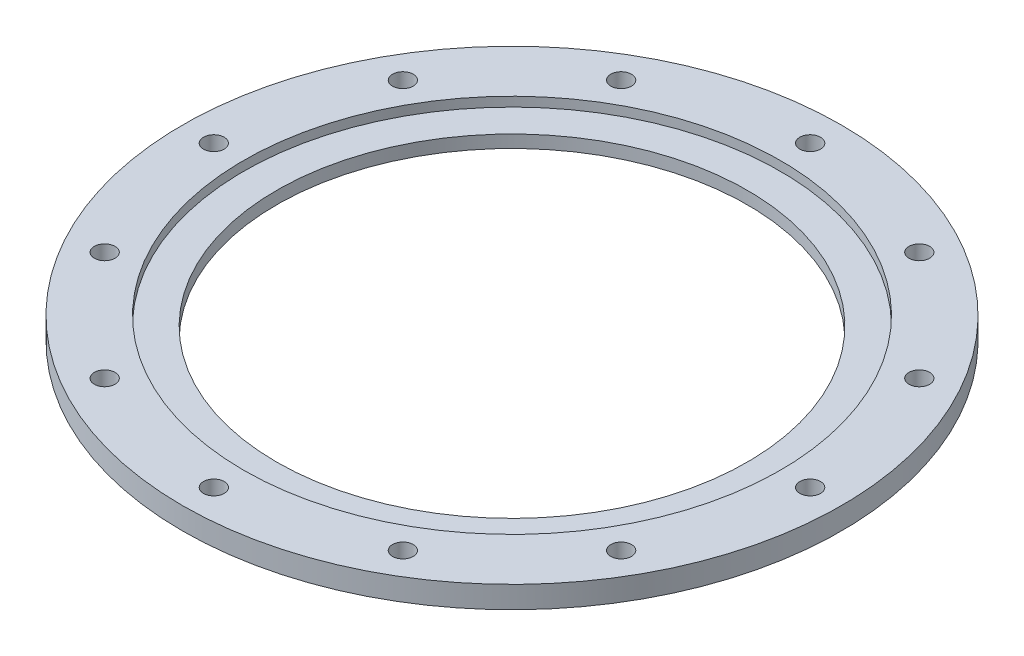
ISO-10303-21;
HEADER;
FILE_DESCRIPTION(('STEP AP214'),'2;1');
FILE_NAME('part.step','',(''),(''),'','','');
FILE_SCHEMA(('AUTOMOTIVE_DESIGN { 1 0 10303 214 1 1 1 1 }'));
ENDSEC;
DATA;
#1=APPLICATION_CONTEXT('core data for automotive mechanical design processes');
#2=APPLICATION_PROTOCOL_DEFINITION('international standard','automotive_design',2000,#1);
#3=PRODUCT_CONTEXT('',#1,'mechanical');
#4=PRODUCT('Part','Part','',(#3));
#5=PRODUCT_RELATED_PRODUCT_CATEGORY('part','',(#4));
#6=PRODUCT_DEFINITION_FORMATION('','',#4);
#7=PRODUCT_DEFINITION_CONTEXT('part definition',#1,'design');
#8=PRODUCT_DEFINITION('design','',#6,#7);
#9=PRODUCT_DEFINITION_SHAPE('','',#8);
#10=(LENGTH_UNIT() NAMED_UNIT(*) SI_UNIT(.MILLI.,.METRE.));
#11=(NAMED_UNIT(*) PLANE_ANGLE_UNIT() SI_UNIT($,.RADIAN.));
#12=(NAMED_UNIT(*) SI_UNIT($,.STERADIAN.) SOLID_ANGLE_UNIT());
#13=UNCERTAINTY_MEASURE_WITH_UNIT(LENGTH_MEASURE(1.E-05),#10,'distance_accuracy_value','');
#14=(GEOMETRIC_REPRESENTATION_CONTEXT(3) GLOBAL_UNCERTAINTY_ASSIGNED_CONTEXT((#13)) GLOBAL_UNIT_ASSIGNED_CONTEXT((#10,
#11,#12)) REPRESENTATION_CONTEXT('',''));
#15=CARTESIAN_POINT('',(0.,0.,0.));
#16=DIRECTION('',(0.,0.,1.));
#17=DIRECTION('',(1.,0.,0.));
#18=AXIS2_PLACEMENT_3D('',#15,#16,#17);
#19=CARTESIAN_POINT('',(0.,2.,0.));
#20=DIRECTION('',(0.,1.,0.));
#21=DIRECTION('',(0.,0.,1.));
#22=AXIS2_PLACEMENT_3D('',#19,#20,#21);
#23=PLANE('',#22);
#24=CARTESIAN_POINT('',(0.,2.,0.));
#25=DIRECTION('',(0.,1.,0.));
#26=DIRECTION('',(0.,0.,1.));
#27=AXIS2_PLACEMENT_3D('',#24,#25,#26);
#28=CIRCLE('',#27,37.5);
#29=CARTESIAN_POINT('',(0.,2.,37.5));
#30=VERTEX_POINT('',#29);
#31=EDGE_CURVE('E49',#30,#30,#28,.T.);
#32=ORIENTED_EDGE('',*,*,#31,.F.);
#33=EDGE_LOOP('',(#32));
#34=FACE_BOUND('',#33,.T.);
#35=CARTESIAN_POINT('',(0.,2.,0.));
#36=DIRECTION('',(0.,1.,0.));
#37=DIRECTION('',(0.,0.,1.));
#38=AXIS2_PLACEMENT_3D('',#35,#36,#37);
#39=CIRCLE('',#38,42.75);
#40=CARTESIAN_POINT('',(0.,2.,42.75));
#41=VERTEX_POINT('',#40);
#42=EDGE_CURVE('E66',#41,#41,#39,.T.);
#43=ORIENTED_EDGE('',*,*,#42,.T.);
#44=EDGE_LOOP('',(#43));
#45=FACE_BOUND('',#44,.T.);
#46=ADVANCED_FACE('F41',(#34,#45),#23,.T.);
#47=CARTESIAN_POINT('',(0.,0.,0.));
#48=DIRECTION('',(0.,1.,0.));
#49=DIRECTION('',(0.,0.,1.));
#50=AXIS2_PLACEMENT_3D('',#47,#48,#49);
#51=PLANE('',#50);
#52=CARTESIAN_POINT('',(23.7499999999999,0.,-41.1362066797609));
#53=DIRECTION('',(0.,-1.,0.));
#54=DIRECTION('',(-0.86602540378444,0.,-0.499999999999998));
#55=AXIS2_PLACEMENT_3D('',#52,#53,#54);
#56=CIRCLE('',#55,1.65);
#57=CARTESIAN_POINT('',(22.3210580837556,0.,-41.9612066797609));
#58=VERTEX_POINT('',#57);
#59=EDGE_CURVE('E147',#58,#58,#56,.T.);
#60=ORIENTED_EDGE('',*,*,#59,.F.);
#61=EDGE_LOOP('',(#60));
#62=FACE_BOUND('',#61,.T.);
#63=CARTESIAN_POINT('',(-1.65845363595049E-13,0.,-47.5));
#64=DIRECTION('',(0.,-1.,0.));
#65=DIRECTION('',(-1.,0.,0.));
#66=AXIS2_PLACEMENT_3D('',#63,#64,#65);
#67=CIRCLE('',#66,1.65);
#68=CARTESIAN_POINT('',(-1.65000000000016,0.,-47.5));
#69=VERTEX_POINT('',#68);
#70=EDGE_CURVE('E139',#69,#69,#67,.T.);
#71=ORIENTED_EDGE('',*,*,#70,.F.);
#72=EDGE_LOOP('',(#71));
#73=FACE_BOUND('',#72,.T.);
#74=CARTESIAN_POINT('',(-23.7500000000002,0.,-41.1362066797607));
#75=DIRECTION('',(0.,-1.,0.));
#76=DIRECTION('',(-0.866025403784436,0.,0.500000000000004));
#77=AXIS2_PLACEMENT_3D('',#74,#75,#76);
#78=CIRCLE('',#77,1.65);
#79=CARTESIAN_POINT('',(-25.1789419162445,0.,-40.3112066797607));
#80=VERTEX_POINT('',#79);
#81=EDGE_CURVE('E131',#80,#80,#78,.T.);
#82=ORIENTED_EDGE('',*,*,#81,.F.);
#83=EDGE_LOOP('',(#82));
#84=FACE_BOUND('',#83,.T.);
#85=CARTESIAN_POINT('',(-41.136206679761,0.,-23.7499999999998));
#86=DIRECTION('',(0.,-1.,0.));
#87=DIRECTION('',(-0.499999999999995,0.,0.866025403784442));
#88=AXIS2_PLACEMENT_3D('',#85,#86,#87);
#89=CIRCLE('',#88,1.65);
#90=CARTESIAN_POINT('',(-41.961206679761,0.,-22.3210580837554));
#91=VERTEX_POINT('',#90);
#92=EDGE_CURVE('E123',#91,#91,#89,.T.);
#93=ORIENTED_EDGE('',*,*,#92,.F.);
#94=EDGE_LOOP('',(#93));
#95=FACE_BOUND('',#94,.T.);
#96=CARTESIAN_POINT('',(-47.5,0.,0.));
#97=DIRECTION('',(0.,-1.,0.));
#98=DIRECTION('',(0.,0.,1.));
#99=AXIS2_PLACEMENT_3D('',#96,#97,#98);
#100=CIRCLE('',#99,1.65);
#101=CARTESIAN_POINT('',(-47.5,0.,1.65));
#102=VERTEX_POINT('',#101);
#103=EDGE_CURVE('E115',#102,#102,#100,.T.);
#104=ORIENTED_EDGE('',*,*,#103,.F.);
#105=EDGE_LOOP('',(#104));
#106=FACE_BOUND('',#105,.T.);
#107=CARTESIAN_POINT('',(-41.1362066797607,0.,23.7500000000003));
#108=DIRECTION('',(0.,-1.,0.));
#109=DIRECTION('',(0.500000000000007,0.,0.866025403784435));
#110=AXIS2_PLACEMENT_3D('',#107,#108,#109);
#111=CIRCLE('',#110,1.65);
#112=CARTESIAN_POINT('',(-40.3112066797606,0.,25.1789419162447));
#113=VERTEX_POINT('',#112);
#114=EDGE_CURVE('E107',#113,#113,#111,.T.);
#115=ORIENTED_EDGE('',*,*,#114,.F.);
#116=EDGE_LOOP('',(#115));
#117=FACE_BOUND('',#116,.T.);
#118=CARTESIAN_POINT('',(-23.7499999999996,0.,41.1362066797611));
#119=DIRECTION('',(0.,-1.,0.));
#120=DIRECTION('',(0.866025403784443,0.,0.499999999999992));
#121=AXIS2_PLACEMENT_3D('',#118,#119,#120);
#122=CIRCLE('',#121,1.65);
#123=CARTESIAN_POINT('',(-22.3210580837553,0.,41.961206679761));
#124=VERTEX_POINT('',#123);
#125=EDGE_CURVE('E99',#124,#124,#122,.T.);
#126=ORIENTED_EDGE('',*,*,#125,.F.);
#127=EDGE_LOOP('',(#126));
#128=FACE_BOUND('',#127,.T.);
#129=CARTESIAN_POINT('',(4.97536090785147E-13,0.,47.5));
#130=DIRECTION('',(0.,-1.,0.));
#131=DIRECTION('',(1.,0.,0.));
#132=AXIS2_PLACEMENT_3D('',#129,#130,#131);
#133=CIRCLE('',#132,1.65);
#134=CARTESIAN_POINT('',(1.65000000000049,0.,47.5));
#135=VERTEX_POINT('',#134);
#136=EDGE_CURVE('E90',#135,#135,#133,.T.);
#137=ORIENTED_EDGE('',*,*,#136,.F.);
#138=EDGE_LOOP('',(#137));
#139=FACE_BOUND('',#138,.T.);
#140=CARTESIAN_POINT('',(23.7500000000005,0.,41.1362066797606));
#141=DIRECTION('',(0.,-1.,0.));
#142=DIRECTION('',(0.866025403784433,0.,-0.50000000000001));
#143=AXIS2_PLACEMENT_3D('',#140,#141,#142);
#144=CIRCLE('',#143,1.65);
#145=CARTESIAN_POINT('',(25.1789419162448,0.,40.3112066797606));
#146=VERTEX_POINT('',#145);
#147=EDGE_CURVE('E162',#146,#146,#144,.T.);
#148=ORIENTED_EDGE('',*,*,#147,.F.);
#149=EDGE_LOOP('',(#148));
#150=FACE_BOUND('',#149,.T.);
#151=CARTESIAN_POINT('',(41.1362066797611,0.,23.7499999999995));
#152=DIRECTION('',(0.,-1.,0.));
#153=DIRECTION('',(0.499999999999989,0.,-0.866025403784445));
#154=AXIS2_PLACEMENT_3D('',#151,#152,#153);
#155=CIRCLE('',#154,1.65);
#156=CARTESIAN_POINT('',(41.9612066797611,0.,22.3210580837551));
#157=VERTEX_POINT('',#156);
#158=EDGE_CURVE('E154',#157,#157,#155,.T.);
#159=ORIENTED_EDGE('',*,*,#158,.F.);
#160=EDGE_LOOP('',(#159));
#161=FACE_BOUND('',#160,.T.);
#162=CARTESIAN_POINT('',(41.1362066797608,0.,-23.7500000000001));
#163=DIRECTION('',(0.,-1.,0.));
#164=DIRECTION('',(-0.500000000000001,0.,-0.866025403784438));
#165=AXIS2_PLACEMENT_3D('',#162,#163,#164);
#166=CIRCLE('',#165,1.65);
#167=CARTESIAN_POINT('',(40.3112066797608,0.,-25.1789419162444));
#168=VERTEX_POINT('',#167);
#169=EDGE_CURVE('E82',#168,#168,#166,.T.);
#170=ORIENTED_EDGE('',*,*,#169,.F.);
#171=EDGE_LOOP('',(#170));
#172=FACE_BOUND('',#171,.T.);
#173=CARTESIAN_POINT('',(47.5,0.,0.));
#174=DIRECTION('',(0.,-1.,0.));
#175=DIRECTION('',(0.,0.,-1.));
#176=AXIS2_PLACEMENT_3D('',#173,#174,#175);
#177=CIRCLE('',#176,1.65);
#178=CARTESIAN_POINT('',(47.5,0.,-1.65));
#179=VERTEX_POINT('',#178);
#180=EDGE_CURVE('E74',#179,#179,#177,.T.);
#181=ORIENTED_EDGE('',*,*,#180,.F.);
#182=EDGE_LOOP('',(#181));
#183=FACE_BOUND('',#182,.T.);
#184=CARTESIAN_POINT('',(0.,0.,0.));
#185=DIRECTION('',(0.,1.,0.));
#186=DIRECTION('',(0.,0.,1.));
#187=AXIS2_PLACEMENT_3D('',#184,#185,#186);
#188=CIRCLE('',#187,52.5);
#189=CARTESIAN_POINT('',(0.,0.,52.5));
#190=VERTEX_POINT('',#189);
#191=EDGE_CURVE('E10',#190,#190,#188,.T.);
#192=ORIENTED_EDGE('',*,*,#191,.F.);
#193=EDGE_LOOP('',(#192));
#194=FACE_BOUND('',#193,.T.);
#195=CARTESIAN_POINT('',(0.,0.,0.));
#196=DIRECTION('',(0.,1.,0.));
#197=DIRECTION('',(0.,0.,1.));
#198=AXIS2_PLACEMENT_3D('',#195,#196,#197);
#199=CIRCLE('',#198,37.5);
#200=CARTESIAN_POINT('',(0.,0.,37.5));
#201=VERTEX_POINT('',#200);
#202=EDGE_CURVE('E54',#201,#201,#199,.T.);
#203=ORIENTED_EDGE('',*,*,#202,.T.);
#204=EDGE_LOOP('',(#203));
#205=FACE_BOUND('',#204,.T.);
#206=ADVANCED_FACE('F181',(#62,#73,#84,#95,#106,#117,#128,#139,#150,#161,#172,#183,#194,#205),
#51,.F.);
#207=CARTESIAN_POINT('',(0.,2.,0.));
#208=DIRECTION('',(0.,-1.,0.));
#209=DIRECTION('',(0.,0.,-1.));
#210=AXIS2_PLACEMENT_3D('',#207,#208,#209);
#211=CYLINDRICAL_SURFACE('',#210,52.5);
#212=ORIENTED_EDGE('',*,*,#191,.T.);
#213=EDGE_LOOP('',(#212));
#214=FACE_BOUND('',#213,.T.);
#215=CARTESIAN_POINT('',(0.,3.5,0.));
#216=DIRECTION('',(0.,1.,0.));
#217=DIRECTION('',(0.,0.,1.));
#218=AXIS2_PLACEMENT_3D('',#215,#216,#217);
#219=CIRCLE('',#218,52.5);
#220=CARTESIAN_POINT('',(0.,3.5,52.5));
#221=VERTEX_POINT('',#220);
#222=EDGE_CURVE('E60',#221,#221,#219,.T.);
#223=ORIENTED_EDGE('',*,*,#222,.F.);
#224=EDGE_LOOP('',(#223));
#225=FACE_BOUND('',#224,.T.);
#226=ADVANCED_FACE('F43',(#214,#225),#211,.T.);
#227=CARTESIAN_POINT('',(0.,2.,0.));
#228=DIRECTION('',(0.,-1.,0.));
#229=DIRECTION('',(0.,0.,-1.));
#230=AXIS2_PLACEMENT_3D('',#227,#228,#229);
#231=CYLINDRICAL_SURFACE('',#230,37.5);
#232=ORIENTED_EDGE('',*,*,#31,.T.);
#233=EDGE_LOOP('',(#232));
#234=FACE_BOUND('',#233,.T.);
#235=ORIENTED_EDGE('',*,*,#202,.F.);
#236=EDGE_LOOP('',(#235));
#237=FACE_BOUND('',#236,.T.);
#238=ADVANCED_FACE('F194',(#234,#237),#231,.F.);
#239=CARTESIAN_POINT('',(0.,3.5,0.));
#240=DIRECTION('',(0.,1.,0.));
#241=DIRECTION('',(0.,0.,1.));
#242=AXIS2_PLACEMENT_3D('',#239,#240,#241);
#243=PLANE('',#242);
#244=CARTESIAN_POINT('',(23.7499999999999,3.5,-41.1362066797609));
#245=DIRECTION('',(0.,-1.,0.));
#246=DIRECTION('',(-0.86602540378444,0.,-0.499999999999998));
#247=AXIS2_PLACEMENT_3D('',#244,#245,#246);
#248=CIRCLE('',#247,1.65);
#249=CARTESIAN_POINT('',(22.3210580837556,3.5,-41.9612066797609));
#250=VERTEX_POINT('',#249);
#251=EDGE_CURVE('E86',#250,#250,#248,.T.);
#252=ORIENTED_EDGE('',*,*,#251,.T.);
#253=EDGE_LOOP('',(#252));
#254=FACE_BOUND('',#253,.T.);
#255=CARTESIAN_POINT('',(-1.65845363595049E-13,3.5,-47.5));
#256=DIRECTION('',(0.,-1.,0.));
#257=DIRECTION('',(-1.,0.,0.));
#258=AXIS2_PLACEMENT_3D('',#255,#256,#257);
#259=CIRCLE('',#258,1.65);
#260=CARTESIAN_POINT('',(-1.65000000000016,3.5,-47.5));
#261=VERTEX_POINT('',#260);
#262=EDGE_CURVE('E143',#261,#261,#259,.T.);
#263=ORIENTED_EDGE('',*,*,#262,.T.);
#264=EDGE_LOOP('',(#263));
#265=FACE_BOUND('',#264,.T.);
#266=CARTESIAN_POINT('',(-23.7500000000002,3.5,-41.1362066797607));
#267=DIRECTION('',(0.,-1.,0.));
#268=DIRECTION('',(-0.866025403784436,0.,0.500000000000004));
#269=AXIS2_PLACEMENT_3D('',#266,#267,#268);
#270=CIRCLE('',#269,1.65);
#271=CARTESIAN_POINT('',(-25.1789419162445,3.5,-40.3112066797607));
#272=VERTEX_POINT('',#271);
#273=EDGE_CURVE('E135',#272,#272,#270,.T.);
#274=ORIENTED_EDGE('',*,*,#273,.T.);
#275=EDGE_LOOP('',(#274));
#276=FACE_BOUND('',#275,.T.);
#277=CARTESIAN_POINT('',(-41.136206679761,3.5,-23.7499999999998));
#278=DIRECTION('',(0.,-1.,0.));
#279=DIRECTION('',(-0.499999999999995,0.,0.866025403784442));
#280=AXIS2_PLACEMENT_3D('',#277,#278,#279);
#281=CIRCLE('',#280,1.65);
#282=CARTESIAN_POINT('',(-41.961206679761,3.5,-22.3210580837554));
#283=VERTEX_POINT('',#282);
#284=EDGE_CURVE('E127',#283,#283,#281,.T.);
#285=ORIENTED_EDGE('',*,*,#284,.T.);
#286=EDGE_LOOP('',(#285));
#287=FACE_BOUND('',#286,.T.);
#288=CARTESIAN_POINT('',(-47.5,3.5,0.));
#289=DIRECTION('',(0.,-1.,0.));
#290=DIRECTION('',(0.,0.,1.));
#291=AXIS2_PLACEMENT_3D('',#288,#289,#290);
#292=CIRCLE('',#291,1.65);
#293=CARTESIAN_POINT('',(-47.5,3.5,1.65));
#294=VERTEX_POINT('',#293);
#295=EDGE_CURVE('E119',#294,#294,#292,.T.);
#296=ORIENTED_EDGE('',*,*,#295,.T.);
#297=EDGE_LOOP('',(#296));
#298=FACE_BOUND('',#297,.T.);
#299=CARTESIAN_POINT('',(-41.1362066797607,3.5,23.7500000000003));
#300=DIRECTION('',(0.,-1.,0.));
#301=DIRECTION('',(0.500000000000007,0.,0.866025403784435));
#302=AXIS2_PLACEMENT_3D('',#299,#300,#301);
#303=CIRCLE('',#302,1.65);
#304=CARTESIAN_POINT('',(-40.3112066797606,3.5,25.1789419162447));
#305=VERTEX_POINT('',#304);
#306=EDGE_CURVE('E111',#305,#305,#303,.T.);
#307=ORIENTED_EDGE('',*,*,#306,.T.);
#308=EDGE_LOOP('',(#307));
#309=FACE_BOUND('',#308,.T.);
#310=CARTESIAN_POINT('',(-23.7499999999996,3.5,41.1362066797611));
#311=DIRECTION('',(0.,-1.,0.));
#312=DIRECTION('',(0.866025403784443,0.,0.499999999999992));
#313=AXIS2_PLACEMENT_3D('',#310,#311,#312);
#314=CIRCLE('',#313,1.65);
#315=CARTESIAN_POINT('',(-22.3210580837553,3.5,41.961206679761));
#316=VERTEX_POINT('',#315);
#317=EDGE_CURVE('E103',#316,#316,#314,.T.);
#318=ORIENTED_EDGE('',*,*,#317,.T.);
#319=EDGE_LOOP('',(#318));
#320=FACE_BOUND('',#319,.T.);
#321=CARTESIAN_POINT('',(4.97536090785147E-13,3.5,47.5));
#322=DIRECTION('',(0.,-1.,0.));
#323=DIRECTION('',(1.,0.,0.));
#324=AXIS2_PLACEMENT_3D('',#321,#322,#323);
#325=CIRCLE('',#324,1.65);
#326=CARTESIAN_POINT('',(1.65000000000049,3.5,47.5));
#327=VERTEX_POINT('',#326);
#328=EDGE_CURVE('E94',#327,#327,#325,.T.);
#329=ORIENTED_EDGE('',*,*,#328,.T.);
#330=EDGE_LOOP('',(#329));
#331=FACE_BOUND('',#330,.T.);
#332=CARTESIAN_POINT('',(23.7500000000005,3.5,41.1362066797606));
#333=DIRECTION('',(0.,-1.,0.));
#334=DIRECTION('',(0.866025403784433,0.,-0.50000000000001));
#335=AXIS2_PLACEMENT_3D('',#332,#333,#334);
#336=CIRCLE('',#335,1.65);
#337=CARTESIAN_POINT('',(25.1789419162448,3.5,40.3112066797606));
#338=VERTEX_POINT('',#337);
#339=EDGE_CURVE('E95',#338,#338,#336,.T.);
#340=ORIENTED_EDGE('',*,*,#339,.T.);
#341=EDGE_LOOP('',(#340));
#342=FACE_BOUND('',#341,.T.);
#343=CARTESIAN_POINT('',(41.1362066797611,3.5,23.7499999999995));
#344=DIRECTION('',(0.,-1.,0.));
#345=DIRECTION('',(0.499999999999989,0.,-0.866025403784445));
#346=AXIS2_PLACEMENT_3D('',#343,#344,#345);
#347=CIRCLE('',#346,1.65);
#348=CARTESIAN_POINT('',(41.9612066797611,3.5,22.3210580837551));
#349=VERTEX_POINT('',#348);
#350=EDGE_CURVE('E158',#349,#349,#347,.T.);
#351=ORIENTED_EDGE('',*,*,#350,.T.);
#352=EDGE_LOOP('',(#351));
#353=FACE_BOUND('',#352,.T.);
#354=CARTESIAN_POINT('',(41.1362066797608,3.5,-23.7500000000001));
#355=DIRECTION('',(0.,-1.,0.));
#356=DIRECTION('',(-0.500000000000001,0.,-0.866025403784438));
#357=AXIS2_PLACEMENT_3D('',#354,#355,#356);
#358=CIRCLE('',#357,1.65);
#359=CARTESIAN_POINT('',(40.3112066797608,3.5,-25.1789419162444));
#360=VERTEX_POINT('',#359);
#361=EDGE_CURVE('E78',#360,#360,#358,.T.);
#362=ORIENTED_EDGE('',*,*,#361,.T.);
#363=EDGE_LOOP('',(#362));
#364=FACE_BOUND('',#363,.T.);
#365=CARTESIAN_POINT('',(47.5,3.5,0.));
#366=DIRECTION('',(0.,-1.,0.));
#367=DIRECTION('',(0.,0.,-1.));
#368=AXIS2_PLACEMENT_3D('',#365,#366,#367);
#369=CIRCLE('',#368,1.65);
#370=CARTESIAN_POINT('',(47.5,3.5,-1.65));
#371=VERTEX_POINT('',#370);
#372=EDGE_CURVE('E70',#371,#371,#369,.T.);
#373=ORIENTED_EDGE('',*,*,#372,.T.);
#374=EDGE_LOOP('',(#373));
#375=FACE_BOUND('',#374,.T.);
#376=ORIENTED_EDGE('',*,*,#222,.T.);
#377=EDGE_LOOP('',(#376));
#378=FACE_BOUND('',#377,.T.);
#379=CARTESIAN_POINT('',(0.,3.5,0.));
#380=DIRECTION('',(0.,1.,0.));
#381=DIRECTION('',(0.,0.,1.));
#382=AXIS2_PLACEMENT_3D('',#379,#380,#381);
#383=CIRCLE('',#382,42.75);
#384=CARTESIAN_POINT('',(0.,3.5,42.75));
#385=VERTEX_POINT('',#384);
#386=EDGE_CURVE('E65',#385,#385,#383,.T.);
#387=ORIENTED_EDGE('',*,*,#386,.F.);
#388=EDGE_LOOP('',(#387));
#389=FACE_BOUND('',#388,.T.);
#390=ADVANCED_FACE('F170',(#254,#265,#276,#287,#298,#309,#320,#331,#342,#353,#364,#375,#378,
#389),#243,.T.);
#391=CARTESIAN_POINT('',(0.,3.5,0.));
#392=DIRECTION('',(0.,-1.,0.));
#393=DIRECTION('',(0.,0.,-1.));
#394=AXIS2_PLACEMENT_3D('',#391,#392,#393);
#395=CYLINDRICAL_SURFACE('',#394,42.75);
#396=ORIENTED_EDGE('',*,*,#386,.T.);
#397=EDGE_LOOP('',(#396));
#398=FACE_BOUND('',#397,.T.);
#399=ORIENTED_EDGE('',*,*,#42,.F.);
#400=EDGE_LOOP('',(#399));
#401=FACE_BOUND('',#400,.T.);
#402=ADVANCED_FACE('F201',(#398,#401),#395,.F.);
#403=CARTESIAN_POINT('',(47.5,3.5,0.));
#404=DIRECTION('',(0.,-1.,0.));
#405=DIRECTION('',(0.,0.,-1.));
#406=AXIS2_PLACEMENT_3D('',#403,#404,#405);
#407=CYLINDRICAL_SURFACE('',#406,1.65);
#408=ORIENTED_EDGE('',*,*,#372,.F.);
#409=EDGE_LOOP('',(#408));
#410=FACE_BOUND('',#409,.T.);
#411=ORIENTED_EDGE('',*,*,#180,.T.);
#412=EDGE_LOOP('',(#411));
#413=FACE_BOUND('',#412,.T.);
#414=ADVANCED_FACE('F213',(#410,#413),#407,.F.);
#415=CARTESIAN_POINT('',(41.1362066797608,3.5,-23.7500000000001));
#416=DIRECTION('',(0.,-1.,0.));
#417=DIRECTION('',(0.,0.,-1.));
#418=AXIS2_PLACEMENT_3D('',#415,#416,#417);
#419=CYLINDRICAL_SURFACE('',#418,1.65);
#420=ORIENTED_EDGE('',*,*,#361,.F.);
#421=EDGE_LOOP('',(#420));
#422=FACE_BOUND('',#421,.T.);
#423=ORIENTED_EDGE('',*,*,#169,.T.);
#424=EDGE_LOOP('',(#423));
#425=FACE_BOUND('',#424,.T.);
#426=ADVANCED_FACE('F219',(#422,#425),#419,.F.);
#427=CARTESIAN_POINT('',(41.1362066797611,3.5,23.7499999999995));
#428=DIRECTION('',(0.,-1.,0.));
#429=DIRECTION('',(0.,0.,-1.));
#430=AXIS2_PLACEMENT_3D('',#427,#428,#429);
#431=CYLINDRICAL_SURFACE('',#430,1.65);
#432=ORIENTED_EDGE('',*,*,#350,.F.);
#433=EDGE_LOOP('',(#432));
#434=FACE_BOUND('',#433,.T.);
#435=ORIENTED_EDGE('',*,*,#158,.T.);
#436=EDGE_LOOP('',(#435));
#437=FACE_BOUND('',#436,.T.);
#438=ADVANCED_FACE('F177',(#434,#437),#431,.F.);
#439=CARTESIAN_POINT('',(23.7500000000005,3.5,41.1362066797606));
#440=DIRECTION('',(0.,-1.,0.));
#441=DIRECTION('',(0.,0.,-1.));
#442=AXIS2_PLACEMENT_3D('',#439,#440,#441);
#443=CYLINDRICAL_SURFACE('',#442,1.65);
#444=ORIENTED_EDGE('',*,*,#339,.F.);
#445=EDGE_LOOP('',(#444));
#446=FACE_BOUND('',#445,.T.);
#447=ORIENTED_EDGE('',*,*,#147,.T.);
#448=EDGE_LOOP('',(#447));
#449=FACE_BOUND('',#448,.T.);
#450=ADVANCED_FACE('F173',(#446,#449),#443,.F.);
#451=CARTESIAN_POINT('',(4.97536090785147E-13,3.5,47.5));
#452=DIRECTION('',(0.,-1.,0.));
#453=DIRECTION('',(0.,0.,-1.));
#454=AXIS2_PLACEMENT_3D('',#451,#452,#453);
#455=CYLINDRICAL_SURFACE('',#454,1.65);
#456=ORIENTED_EDGE('',*,*,#328,.F.);
#457=EDGE_LOOP('',(#456));
#458=FACE_BOUND('',#457,.T.);
#459=ORIENTED_EDGE('',*,*,#136,.T.);
#460=EDGE_LOOP('',(#459));
#461=FACE_BOUND('',#460,.T.);
#462=ADVANCED_FACE('F176',(#458,#461),#455,.F.);
#463=CARTESIAN_POINT('',(-23.7499999999996,3.5,41.1362066797611));
#464=DIRECTION('',(0.,-1.,0.));
#465=DIRECTION('',(0.,0.,-1.));
#466=AXIS2_PLACEMENT_3D('',#463,#464,#465);
#467=CYLINDRICAL_SURFACE('',#466,1.65);
#468=ORIENTED_EDGE('',*,*,#317,.F.);
#469=EDGE_LOOP('',(#468));
#470=FACE_BOUND('',#469,.T.);
#471=ORIENTED_EDGE('',*,*,#125,.T.);
#472=EDGE_LOOP('',(#471));
#473=FACE_BOUND('',#472,.T.);
#474=ADVANCED_FACE('F228',(#470,#473),#467,.F.);
#475=CARTESIAN_POINT('',(-41.1362066797607,3.5,23.7500000000003));
#476=DIRECTION('',(0.,-1.,0.));
#477=DIRECTION('',(0.,0.,-1.));
#478=AXIS2_PLACEMENT_3D('',#475,#476,#477);
#479=CYLINDRICAL_SURFACE('',#478,1.65);
#480=ORIENTED_EDGE('',*,*,#306,.F.);
#481=EDGE_LOOP('',(#480));
#482=FACE_BOUND('',#481,.T.);
#483=ORIENTED_EDGE('',*,*,#114,.T.);
#484=EDGE_LOOP('',(#483));
#485=FACE_BOUND('',#484,.T.);
#486=ADVANCED_FACE('F232',(#482,#485),#479,.F.);
#487=CARTESIAN_POINT('',(-47.5,3.5,0.));
#488=DIRECTION('',(0.,-1.,0.));
#489=DIRECTION('',(0.,0.,-1.));
#490=AXIS2_PLACEMENT_3D('',#487,#488,#489);
#491=CYLINDRICAL_SURFACE('',#490,1.65);
#492=ORIENTED_EDGE('',*,*,#295,.F.);
#493=EDGE_LOOP('',(#492));
#494=FACE_BOUND('',#493,.T.);
#495=ORIENTED_EDGE('',*,*,#103,.T.);
#496=EDGE_LOOP('',(#495));
#497=FACE_BOUND('',#496,.T.);
#498=ADVANCED_FACE('F236',(#494,#497),#491,.F.);
#499=CARTESIAN_POINT('',(-41.136206679761,3.5,-23.7499999999998));
#500=DIRECTION('',(0.,-1.,0.));
#501=DIRECTION('',(0.,0.,-1.));
#502=AXIS2_PLACEMENT_3D('',#499,#500,#501);
#503=CYLINDRICAL_SURFACE('',#502,1.65);
#504=ORIENTED_EDGE('',*,*,#284,.F.);
#505=EDGE_LOOP('',(#504));
#506=FACE_BOUND('',#505,.T.);
#507=ORIENTED_EDGE('',*,*,#92,.T.);
#508=EDGE_LOOP('',(#507));
#509=FACE_BOUND('',#508,.T.);
#510=ADVANCED_FACE('F240',(#506,#509),#503,.F.);
#511=CARTESIAN_POINT('',(-23.7500000000002,3.5,-41.1362066797607));
#512=DIRECTION('',(0.,-1.,0.));
#513=DIRECTION('',(0.,0.,-1.));
#514=AXIS2_PLACEMENT_3D('',#511,#512,#513);
#515=CYLINDRICAL_SURFACE('',#514,1.65);
#516=ORIENTED_EDGE('',*,*,#273,.F.);
#517=EDGE_LOOP('',(#516));
#518=FACE_BOUND('',#517,.T.);
#519=ORIENTED_EDGE('',*,*,#81,.T.);
#520=EDGE_LOOP('',(#519));
#521=FACE_BOUND('',#520,.T.);
#522=ADVANCED_FACE('F244',(#518,#521),#515,.F.);
#523=CARTESIAN_POINT('',(-1.65845363595049E-13,3.5,-47.5));
#524=DIRECTION('',(0.,-1.,0.));
#525=DIRECTION('',(0.,0.,-1.));
#526=AXIS2_PLACEMENT_3D('',#523,#524,#525);
#527=CYLINDRICAL_SURFACE('',#526,1.65);
#528=ORIENTED_EDGE('',*,*,#262,.F.);
#529=EDGE_LOOP('',(#528));
#530=FACE_BOUND('',#529,.T.);
#531=ORIENTED_EDGE('',*,*,#70,.T.);
#532=EDGE_LOOP('',(#531));
#533=FACE_BOUND('',#532,.T.);
#534=ADVANCED_FACE('F248',(#530,#533),#527,.F.);
#535=CARTESIAN_POINT('',(23.7499999999999,3.5,-41.1362066797609));
#536=DIRECTION('',(0.,-1.,0.));
#537=DIRECTION('',(0.,0.,-1.));
#538=AXIS2_PLACEMENT_3D('',#535,#536,#537);
#539=CYLINDRICAL_SURFACE('',#538,1.65);
#540=ORIENTED_EDGE('',*,*,#251,.F.);
#541=EDGE_LOOP('',(#540));
#542=FACE_BOUND('',#541,.T.);
#543=ORIENTED_EDGE('',*,*,#59,.T.);
#544=EDGE_LOOP('',(#543));
#545=FACE_BOUND('',#544,.T.);
#546=ADVANCED_FACE('F252',(#542,#545),#539,.F.);
#547=CLOSED_SHELL('',(#46,#206,#226,#238,#390,#402,#414,#426,#438,#450,#462,#474,#486,#498,#510,
#522,#534,#546));
#548=MANIFOLD_SOLID_BREP('B2',#547);
#549=ADVANCED_BREP_SHAPE_REPRESENTATION('',(#18,#548),#14);
#550=SHAPE_DEFINITION_REPRESENTATION(#9,#549);
ENDSEC;
END-ISO-10303-21;
